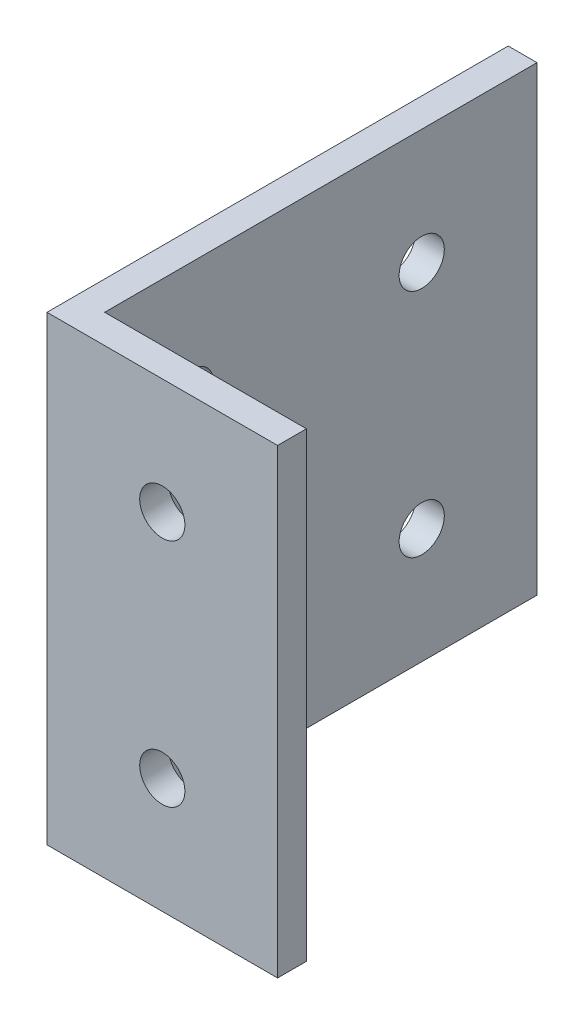
ISO-10303-21;
HEADER;
FILE_DESCRIPTION(('STEP AP214'),'2;1');
FILE_NAME('part.step','',(''),(''),'','','');
FILE_SCHEMA(('AUTOMOTIVE_DESIGN { 1 0 10303 214 1 1 1 1 }'));
ENDSEC;
DATA;
#1=APPLICATION_CONTEXT('core data for automotive mechanical design processes');
#2=APPLICATION_PROTOCOL_DEFINITION('international standard','automotive_design',2000,#1);
#3=PRODUCT_CONTEXT('',#1,'mechanical');
#4=PRODUCT('Part','Part','',(#3));
#5=PRODUCT_RELATED_PRODUCT_CATEGORY('part','',(#4));
#6=PRODUCT_DEFINITION_FORMATION('','',#4);
#7=PRODUCT_DEFINITION_CONTEXT('part definition',#1,'design');
#8=PRODUCT_DEFINITION('design','',#6,#7);
#9=PRODUCT_DEFINITION_SHAPE('','',#8);
#10=(LENGTH_UNIT() NAMED_UNIT(*) SI_UNIT(.MILLI.,.METRE.));
#11=(NAMED_UNIT(*) PLANE_ANGLE_UNIT() SI_UNIT($,.RADIAN.));
#12=(NAMED_UNIT(*) SI_UNIT($,.STERADIAN.) SOLID_ANGLE_UNIT());
#13=UNCERTAINTY_MEASURE_WITH_UNIT(LENGTH_MEASURE(1.E-05),#10,'distance_accuracy_value','');
#14=(GEOMETRIC_REPRESENTATION_CONTEXT(3) GLOBAL_UNCERTAINTY_ASSIGNED_CONTEXT((#13)) GLOBAL_UNIT_ASSIGNED_CONTEXT((#10,
#11,#12)) REPRESENTATION_CONTEXT('',''));
#15=CARTESIAN_POINT('',(0.,0.,0.));
#16=DIRECTION('',(0.,0.,1.));
#17=DIRECTION('',(1.,0.,0.));
#18=AXIS2_PLACEMENT_3D('',#15,#16,#17);
#19=CARTESIAN_POINT('',(25.4,50.8,0.));
#20=DIRECTION('',(0.,0.,-1.));
#21=DIRECTION('',(-1.,0.,0.));
#22=AXIS2_PLACEMENT_3D('',#19,#20,#21);
#23=PLANE('',#22);
#24=CARTESIAN_POINT('',(12.7,38.1,0.));
#25=DIRECTION('',(0.,0.,-1.));
#26=DIRECTION('',(-1.,0.,0.));
#27=AXIS2_PLACEMENT_3D('',#24,#25,#26);
#28=CIRCLE('',#27,2.4892);
#29=CARTESIAN_POINT('',(10.2108,38.1,0.));
#30=VERTEX_POINT('',#29);
#31=EDGE_CURVE('E186',#30,#30,#28,.T.);
#32=ORIENTED_EDGE('',*,*,#31,.T.);
#33=EDGE_LOOP('',(#32));
#34=FACE_BOUND('',#33,.T.);
#35=CARTESIAN_POINT('',(12.7,12.7,0.));
#36=DIRECTION('',(0.,0.,-1.));
#37=DIRECTION('',(-1.,0.,0.));
#38=AXIS2_PLACEMENT_3D('',#35,#36,#37);
#39=CIRCLE('',#38,2.4892);
#40=CARTESIAN_POINT('',(10.2108,12.7,0.));
#41=VERTEX_POINT('',#40);
#42=EDGE_CURVE('E189',#41,#41,#39,.T.);
#43=ORIENTED_EDGE('',*,*,#42,.T.);
#44=EDGE_LOOP('',(#43));
#45=FACE_BOUND('',#44,.T.);
#46=DIRECTION('',(1.,0.,0.));
#47=VECTOR('',#46,1.);
#48=CARTESIAN_POINT('',(25.4,0.,0.));
#49=LINE('',#48,#47);
#50=CARTESIAN_POINT('',(0.,0.,0.));
#51=VERTEX_POINT('',#50);
#52=CARTESIAN_POINT('',(25.4,0.,0.));
#53=VERTEX_POINT('',#52);
#54=EDGE_CURVE('E129',#51,#53,#49,.T.);
#55=ORIENTED_EDGE('',*,*,#54,.T.);
#56=DIRECTION('',(0.,-1.,0.));
#57=VECTOR('',#56,1.);
#58=CARTESIAN_POINT('',(25.4,50.8,0.));
#59=LINE('',#58,#57);
#60=CARTESIAN_POINT('',(25.4,50.8,0.));
#61=VERTEX_POINT('',#60);
#62=EDGE_CURVE('E11',#61,#53,#59,.T.);
#63=ORIENTED_EDGE('',*,*,#62,.F.);
#64=DIRECTION('',(1.,0.,0.));
#65=VECTOR('',#64,1.);
#66=CARTESIAN_POINT('',(25.4,50.8,0.));
#67=LINE('',#66,#65);
#68=CARTESIAN_POINT('',(0.,50.8,0.));
#69=VERTEX_POINT('',#68);
#70=EDGE_CURVE('E146',#69,#61,#67,.T.);
#71=ORIENTED_EDGE('',*,*,#70,.F.);
#72=DIRECTION('',(0.,-1.,0.));
#73=VECTOR('',#72,1.);
#74=CARTESIAN_POINT('',(0.,50.8,0.));
#75=LINE('',#74,#73);
#76=EDGE_CURVE('E125',#69,#51,#75,.T.);
#77=ORIENTED_EDGE('',*,*,#76,.T.);
#78=EDGE_LOOP('',(#55,#63,#71,#77));
#79=FACE_BOUND('',#78,.T.);
#80=ADVANCED_FACE('F39',(#34,#45,#79),#23,.F.);
#81=CARTESIAN_POINT('',(25.4,50.8,-3.175));
#82=DIRECTION('',(-1.,0.,0.));
#83=DIRECTION('',(0.,0.,1.));
#84=AXIS2_PLACEMENT_3D('',#81,#82,#83);
#85=PLANE('',#84);
#86=DIRECTION('',(0.,0.,-1.));
#87=VECTOR('',#86,1.);
#88=CARTESIAN_POINT('',(25.4,0.,-3.175));
#89=LINE('',#88,#87);
#90=CARTESIAN_POINT('',(25.4,0.,-3.175));
#91=VERTEX_POINT('',#90);
#92=EDGE_CURVE('E133',#53,#91,#89,.T.);
#93=ORIENTED_EDGE('',*,*,#92,.T.);
#94=DIRECTION('',(0.,-1.,0.));
#95=VECTOR('',#94,1.);
#96=CARTESIAN_POINT('',(25.4,50.8,-3.175));
#97=LINE('',#96,#95);
#98=CARTESIAN_POINT('',(25.4,50.8,-3.175));
#99=VERTEX_POINT('',#98);
#100=EDGE_CURVE('E48',#99,#91,#97,.T.);
#101=ORIENTED_EDGE('',*,*,#100,.F.);
#102=DIRECTION('',(0.,0.,-1.));
#103=VECTOR('',#102,1.);
#104=CARTESIAN_POINT('',(25.4,50.8,-3.175));
#105=LINE('',#104,#103);
#106=EDGE_CURVE('E93',#61,#99,#105,.T.);
#107=ORIENTED_EDGE('',*,*,#106,.F.);
#108=ORIENTED_EDGE('',*,*,#62,.T.);
#109=EDGE_LOOP('',(#93,#101,#107,#108));
#110=FACE_BOUND('',#109,.T.);
#111=ADVANCED_FACE('F178',(#110),#85,.F.);
#112=CARTESIAN_POINT('',(3.175,50.8,-3.175));
#113=DIRECTION('',(0.,0.,1.));
#114=DIRECTION('',(1.,0.,0.));
#115=AXIS2_PLACEMENT_3D('',#112,#113,#114);
#116=PLANE('',#115);
#117=CARTESIAN_POINT('',(12.7,38.1,-3.175));
#118=DIRECTION('',(0.,0.,-1.));
#119=DIRECTION('',(-1.,0.,0.));
#120=AXIS2_PLACEMENT_3D('',#117,#118,#119);
#121=CIRCLE('',#120,2.4892);
#122=CARTESIAN_POINT('',(10.2108,38.1,-3.175));
#123=VERTEX_POINT('',#122);
#124=EDGE_CURVE('E197',#123,#123,#121,.T.);
#125=ORIENTED_EDGE('',*,*,#124,.F.);
#126=EDGE_LOOP('',(#125));
#127=FACE_BOUND('',#126,.T.);
#128=CARTESIAN_POINT('',(12.7,12.7,-3.175));
#129=DIRECTION('',(0.,0.,-1.));
#130=DIRECTION('',(-1.,0.,0.));
#131=AXIS2_PLACEMENT_3D('',#128,#129,#130);
#132=CIRCLE('',#131,2.4892);
#133=CARTESIAN_POINT('',(10.2108,12.7,-3.175));
#134=VERTEX_POINT('',#133);
#135=EDGE_CURVE('E192',#134,#134,#132,.T.);
#136=ORIENTED_EDGE('',*,*,#135,.F.);
#137=EDGE_LOOP('',(#136));
#138=FACE_BOUND('',#137,.T.);
#139=DIRECTION('',(-1.,0.,0.));
#140=VECTOR('',#139,1.);
#141=CARTESIAN_POINT('',(3.175,0.,-3.175));
#142=LINE('',#141,#140);
#143=CARTESIAN_POINT('',(3.175,0.,-3.175));
#144=VERTEX_POINT('',#143);
#145=EDGE_CURVE('E137',#91,#144,#142,.T.);
#146=ORIENTED_EDGE('',*,*,#145,.T.);
#147=DIRECTION('',(0.,-1.,0.));
#148=VECTOR('',#147,1.);
#149=CARTESIAN_POINT('',(3.175,50.8,-3.175));
#150=LINE('',#149,#148);
#151=CARTESIAN_POINT('',(3.175,50.8,-3.175));
#152=VERTEX_POINT('',#151);
#153=EDGE_CURVE('E117',#152,#144,#150,.T.);
#154=ORIENTED_EDGE('',*,*,#153,.F.);
#155=DIRECTION('',(-1.,0.,0.));
#156=VECTOR('',#155,1.);
#157=CARTESIAN_POINT('',(3.175,50.8,-3.175));
#158=LINE('',#157,#156);
#159=EDGE_CURVE('E106',#99,#152,#158,.T.);
#160=ORIENTED_EDGE('',*,*,#159,.F.);
#161=ORIENTED_EDGE('',*,*,#100,.T.);
#162=EDGE_LOOP('',(#146,#154,#160,#161));
#163=FACE_BOUND('',#162,.T.);
#164=ADVANCED_FACE('F157',(#127,#138,#163),#116,.F.);
#165=CARTESIAN_POINT('',(3.175,50.8,-50.8));
#166=DIRECTION('',(-1.,0.,0.));
#167=DIRECTION('',(0.,0.,1.));
#168=AXIS2_PLACEMENT_3D('',#165,#166,#167);
#169=PLANE('',#168);
#170=CARTESIAN_POINT('',(3.175,38.1,-12.7));
#171=DIRECTION('',(1.,0.,0.));
#172=DIRECTION('',(0.,0.,-1.));
#173=AXIS2_PLACEMENT_3D('',#170,#171,#172);
#174=CIRCLE('',#173,2.4892);
#175=CARTESIAN_POINT('',(3.175,38.1,-15.1892));
#176=VERTEX_POINT('',#175);
#177=EDGE_CURVE('E218',#176,#176,#174,.T.);
#178=ORIENTED_EDGE('',*,*,#177,.F.);
#179=EDGE_LOOP('',(#178));
#180=FACE_BOUND('',#179,.T.);
#181=CARTESIAN_POINT('',(3.175,12.7,-12.7));
#182=DIRECTION('',(1.,0.,0.));
#183=DIRECTION('',(0.,0.,-1.));
#184=AXIS2_PLACEMENT_3D('',#181,#182,#183);
#185=CIRCLE('',#184,2.4892);
#186=CARTESIAN_POINT('',(3.175,12.7,-15.1892));
#187=VERTEX_POINT('',#186);
#188=EDGE_CURVE('E210',#187,#187,#185,.T.);
#189=ORIENTED_EDGE('',*,*,#188,.F.);
#190=EDGE_LOOP('',(#189));
#191=FACE_BOUND('',#190,.T.);
#192=CARTESIAN_POINT('',(3.175,12.7,-38.1));
#193=DIRECTION('',(1.,0.,0.));
#194=DIRECTION('',(0.,0.,-1.));
#195=AXIS2_PLACEMENT_3D('',#192,#193,#194);
#196=CIRCLE('',#195,2.4892);
#197=CARTESIAN_POINT('',(3.175,12.7,-40.5892));
#198=VERTEX_POINT('',#197);
#199=EDGE_CURVE('E201',#198,#198,#196,.T.);
#200=ORIENTED_EDGE('',*,*,#199,.F.);
#201=EDGE_LOOP('',(#200));
#202=FACE_BOUND('',#201,.T.);
#203=CARTESIAN_POINT('',(3.175,38.1,-38.1));
#204=DIRECTION('',(1.,0.,0.));
#205=DIRECTION('',(0.,0.,-1.));
#206=AXIS2_PLACEMENT_3D('',#203,#204,#205);
#207=CIRCLE('',#206,2.4892);
#208=CARTESIAN_POINT('',(3.175,38.1,-40.5892));
#209=VERTEX_POINT('',#208);
#210=EDGE_CURVE('E205',#209,#209,#207,.T.);
#211=ORIENTED_EDGE('',*,*,#210,.F.);
#212=EDGE_LOOP('',(#211));
#213=FACE_BOUND('',#212,.T.);
#214=DIRECTION('',(0.,0.,-1.));
#215=VECTOR('',#214,1.);
#216=CARTESIAN_POINT('',(3.175,0.,-50.8));
#217=LINE('',#216,#215);
#218=CARTESIAN_POINT('',(3.175,0.,-50.8));
#219=VERTEX_POINT('',#218);
#220=EDGE_CURVE('E115',#144,#219,#217,.T.);
#221=ORIENTED_EDGE('',*,*,#220,.T.);
#222=DIRECTION('',(0.,-1.,0.));
#223=VECTOR('',#222,1.);
#224=CARTESIAN_POINT('',(3.175,50.8,-50.8));
#225=LINE('',#224,#223);
#226=CARTESIAN_POINT('',(3.175,50.8,-50.8));
#227=VERTEX_POINT('',#226);
#228=EDGE_CURVE('E112',#227,#219,#225,.T.);
#229=ORIENTED_EDGE('',*,*,#228,.F.);
#230=DIRECTION('',(0.,0.,-1.));
#231=VECTOR('',#230,1.);
#232=CARTESIAN_POINT('',(3.175,50.8,-50.8));
#233=LINE('',#232,#231);
#234=EDGE_CURVE('E100',#152,#227,#233,.T.);
#235=ORIENTED_EDGE('',*,*,#234,.F.);
#236=ORIENTED_EDGE('',*,*,#153,.T.);
#237=EDGE_LOOP('',(#221,#229,#235,#236));
#238=FACE_BOUND('',#237,.T.);
#239=ADVANCED_FACE('F113',(#180,#191,#202,#213,#238),#169,.F.);
#240=CARTESIAN_POINT('',(0.,50.8,-50.8));
#241=DIRECTION('',(0.,0.,1.));
#242=DIRECTION('',(1.,0.,0.));
#243=AXIS2_PLACEMENT_3D('',#240,#241,#242);
#244=PLANE('',#243);
#245=DIRECTION('',(-1.,0.,0.));
#246=VECTOR('',#245,1.);
#247=CARTESIAN_POINT('',(0.,0.,-50.8));
#248=LINE('',#247,#246);
#249=CARTESIAN_POINT('',(0.,0.,-50.8));
#250=VERTEX_POINT('',#249);
#251=EDGE_CURVE('E79',#219,#250,#248,.T.);
#252=ORIENTED_EDGE('',*,*,#251,.T.);
#253=DIRECTION('',(0.,-1.,0.));
#254=VECTOR('',#253,1.);
#255=CARTESIAN_POINT('',(0.,50.8,-50.8));
#256=LINE('',#255,#254);
#257=CARTESIAN_POINT('',(0.,50.8,-50.8));
#258=VERTEX_POINT('',#257);
#259=EDGE_CURVE('E118',#258,#250,#256,.T.);
#260=ORIENTED_EDGE('',*,*,#259,.F.);
#261=DIRECTION('',(-1.,0.,0.));
#262=VECTOR('',#261,1.);
#263=CARTESIAN_POINT('',(0.,50.8,-50.8));
#264=LINE('',#263,#262);
#265=EDGE_CURVE('E104',#227,#258,#264,.T.);
#266=ORIENTED_EDGE('',*,*,#265,.F.);
#267=ORIENTED_EDGE('',*,*,#228,.T.);
#268=EDGE_LOOP('',(#252,#260,#266,#267));
#269=FACE_BOUND('',#268,.T.);
#270=ADVANCED_FACE('F120',(#269),#244,.F.);
#271=CARTESIAN_POINT('',(0.,50.8,0.));
#272=DIRECTION('',(1.,0.,0.));
#273=DIRECTION('',(0.,0.,-1.));
#274=AXIS2_PLACEMENT_3D('',#271,#272,#273);
#275=PLANE('',#274);
#276=CARTESIAN_POINT('',(0.,38.1,-12.7));
#277=DIRECTION('',(1.,0.,0.));
#278=DIRECTION('',(0.,0.,-1.));
#279=AXIS2_PLACEMENT_3D('',#276,#277,#278);
#280=CIRCLE('',#279,2.4892);
#281=CARTESIAN_POINT('',(0.,38.1,-15.1892));
#282=VERTEX_POINT('',#281);
#283=EDGE_CURVE('E222',#282,#282,#280,.T.);
#284=ORIENTED_EDGE('',*,*,#283,.T.);
#285=EDGE_LOOP('',(#284));
#286=FACE_BOUND('',#285,.T.);
#287=CARTESIAN_POINT('',(0.,12.7,-12.7));
#288=DIRECTION('',(1.,0.,0.));
#289=DIRECTION('',(0.,0.,-1.));
#290=AXIS2_PLACEMENT_3D('',#287,#288,#289);
#291=CIRCLE('',#290,2.4892);
#292=CARTESIAN_POINT('',(0.,12.7,-15.1892));
#293=VERTEX_POINT('',#292);
#294=EDGE_CURVE('E214',#293,#293,#291,.T.);
#295=ORIENTED_EDGE('',*,*,#294,.T.);
#296=EDGE_LOOP('',(#295));
#297=FACE_BOUND('',#296,.T.);
#298=CARTESIAN_POINT('',(0.,12.7,-38.1));
#299=DIRECTION('',(1.,0.,0.));
#300=DIRECTION('',(0.,0.,-1.));
#301=AXIS2_PLACEMENT_3D('',#298,#299,#300);
#302=CIRCLE('',#301,2.4892);
#303=CARTESIAN_POINT('',(0.,12.7,-40.5892));
#304=VERTEX_POINT('',#303);
#305=EDGE_CURVE('E206',#304,#304,#302,.T.);
#306=ORIENTED_EDGE('',*,*,#305,.T.);
#307=EDGE_LOOP('',(#306));
#308=FACE_BOUND('',#307,.T.);
#309=CARTESIAN_POINT('',(0.,38.1,-38.1));
#310=DIRECTION('',(1.,0.,0.));
#311=DIRECTION('',(0.,0.,-1.));
#312=AXIS2_PLACEMENT_3D('',#309,#310,#311);
#313=CIRCLE('',#312,2.4892);
#314=CARTESIAN_POINT('',(0.,38.1,-40.5892));
#315=VERTEX_POINT('',#314);
#316=EDGE_CURVE('E134',#315,#315,#313,.T.);
#317=ORIENTED_EDGE('',*,*,#316,.T.);
#318=EDGE_LOOP('',(#317));
#319=FACE_BOUND('',#318,.T.);
#320=DIRECTION('',(0.,0.,1.));
#321=VECTOR('',#320,1.);
#322=CARTESIAN_POINT('',(0.,0.,0.));
#323=LINE('',#322,#321);
#324=EDGE_CURVE('E85',#250,#51,#323,.T.);
#325=ORIENTED_EDGE('',*,*,#324,.T.);
#326=ORIENTED_EDGE('',*,*,#76,.F.);
#327=DIRECTION('',(0.,0.,1.));
#328=VECTOR('',#327,1.);
#329=CARTESIAN_POINT('',(0.,50.8,0.));
#330=LINE('',#329,#328);
#331=EDGE_CURVE('E56',#258,#69,#330,.T.);
#332=ORIENTED_EDGE('',*,*,#331,.F.);
#333=ORIENTED_EDGE('',*,*,#259,.T.);
#334=EDGE_LOOP('',(#325,#326,#332,#333));
#335=FACE_BOUND('',#334,.T.);
#336=ADVANCED_FACE('F164',(#286,#297,#308,#319,#335),#275,.F.);
#337=CARTESIAN_POINT('',(0.,50.8,0.));
#338=DIRECTION('',(0.,-1.,0.));
#339=DIRECTION('',(0.,0.,-1.));
#340=AXIS2_PLACEMENT_3D('',#337,#338,#339);
#341=PLANE('',#340);
#342=ORIENTED_EDGE('',*,*,#70,.T.);
#343=ORIENTED_EDGE('',*,*,#106,.T.);
#344=ORIENTED_EDGE('',*,*,#159,.T.);
#345=ORIENTED_EDGE('',*,*,#234,.T.);
#346=ORIENTED_EDGE('',*,*,#265,.T.);
#347=ORIENTED_EDGE('',*,*,#331,.T.);
#348=EDGE_LOOP('',(#342,#343,#344,#345,#346,#347));
#349=FACE_BOUND('',#348,.T.);
#350=ADVANCED_FACE('F102',(#349),#341,.F.);
#351=CARTESIAN_POINT('',(0.,0.,0.));
#352=DIRECTION('',(0.,-1.,0.));
#353=DIRECTION('',(0.,0.,-1.));
#354=AXIS2_PLACEMENT_3D('',#351,#352,#353);
#355=PLANE('',#354);
#356=ORIENTED_EDGE('',*,*,#54,.F.);
#357=ORIENTED_EDGE('',*,*,#324,.F.);
#358=ORIENTED_EDGE('',*,*,#251,.F.);
#359=ORIENTED_EDGE('',*,*,#220,.F.);
#360=ORIENTED_EDGE('',*,*,#145,.F.);
#361=ORIENTED_EDGE('',*,*,#92,.F.);
#362=EDGE_LOOP('',(#356,#357,#358,#359,#360,#361));
#363=FACE_BOUND('',#362,.T.);
#364=ADVANCED_FACE('F160',(#363),#355,.T.);
#365=CARTESIAN_POINT('',(0.,38.1,-38.1));
#366=DIRECTION('',(1.,0.,0.));
#367=DIRECTION('',(0.,0.,-1.));
#368=AXIS2_PLACEMENT_3D('',#365,#366,#367);
#369=CYLINDRICAL_SURFACE('',#368,2.4892);
#370=CARTESIAN_POINT('',(0.,38.1,-40.5892));
#371=CARTESIAN_POINT('',(0.0330729166666635,38.1,-40.5892));
#372=CARTESIAN_POINT('',(0.0661458333333302,38.1,-40.5892));
#373=CARTESIAN_POINT('',(0.132291666666664,38.1,-40.5892));
#374=CARTESIAN_POINT('',(0.16536458333333,38.1,-40.5892));
#375=CARTESIAN_POINT('',(0.231510416666664,38.1,-40.5892));
#376=CARTESIAN_POINT('',(0.26458333333333,38.1,-40.5892));
#377=CARTESIAN_POINT('',(0.330729166666664,38.1,-40.5892));
#378=CARTESIAN_POINT('',(0.363802083333331,38.1,-40.5892));
#379=CARTESIAN_POINT('',(0.429947916666664,38.1,-40.5892));
#380=CARTESIAN_POINT('',(0.463020833333331,38.1,-40.5892));
#381=CARTESIAN_POINT('',(0.529166666666664,38.1,-40.5892));
#382=CARTESIAN_POINT('',(0.562239583333331,38.1,-40.5892));
#383=CARTESIAN_POINT('',(0.628385416666664,38.1,-40.5892));
#384=CARTESIAN_POINT('',(0.661458333333331,38.1,-40.5892));
#385=CARTESIAN_POINT('',(0.727604166666664,38.1,-40.5892));
#386=CARTESIAN_POINT('',(0.760677083333331,38.1,-40.5892));
#387=CARTESIAN_POINT('',(0.826822916666664,38.1,-40.5892));
#388=CARTESIAN_POINT('',(0.859895833333331,38.1,-40.5892));
#389=CARTESIAN_POINT('',(0.926041666666665,38.1,-40.5892));
#390=CARTESIAN_POINT('',(0.959114583333331,38.1,-40.5892));
#391=CARTESIAN_POINT('',(1.02526041666666,38.1,-40.5892));
#392=CARTESIAN_POINT('',(1.05833333333333,38.1,-40.5892));
#393=CARTESIAN_POINT('',(1.12447916666666,38.1,-40.5892));
#394=CARTESIAN_POINT('',(1.15755208333333,38.1,-40.5892));
#395=CARTESIAN_POINT('',(1.22369791666666,38.1,-40.5892));
#396=CARTESIAN_POINT('',(1.25677083333333,38.1,-40.5892));
#397=CARTESIAN_POINT('',(1.32291666666666,38.1,-40.5892));
#398=CARTESIAN_POINT('',(1.35598958333333,38.1,-40.5892));
#399=CARTESIAN_POINT('',(1.42213541666667,38.1,-40.5892));
#400=CARTESIAN_POINT('',(1.45520833333333,38.1,-40.5892));
#401=CARTESIAN_POINT('',(1.52135416666667,38.1,-40.5892));
#402=CARTESIAN_POINT('',(1.55442708333333,38.1,-40.5892));
#403=CARTESIAN_POINT('',(1.62057291666667,38.1,-40.5892));
#404=CARTESIAN_POINT('',(1.65364583333333,38.1,-40.5892));
#405=CARTESIAN_POINT('',(1.71979166666667,38.1,-40.5892));
#406=CARTESIAN_POINT('',(1.75286458333333,38.1,-40.5892));
#407=CARTESIAN_POINT('',(1.81901041666667,38.1,-40.5892));
#408=CARTESIAN_POINT('',(1.85208333333333,38.1,-40.5892));
#409=CARTESIAN_POINT('',(1.91822916666667,38.1,-40.5892));
#410=CARTESIAN_POINT('',(1.95130208333333,38.1,-40.5892));
#411=CARTESIAN_POINT('',(2.01744791666667,38.1,-40.5892));
#412=CARTESIAN_POINT('',(2.05052083333333,38.1,-40.5892));
#413=CARTESIAN_POINT('',(2.11666666666667,38.1,-40.5892));
#414=CARTESIAN_POINT('',(2.14973958333333,38.1,-40.5892));
#415=CARTESIAN_POINT('',(2.21588541666667,38.1,-40.5892));
#416=CARTESIAN_POINT('',(2.24895833333333,38.1,-40.5892));
#417=CARTESIAN_POINT('',(2.31510416666667,38.1,-40.5892));
#418=CARTESIAN_POINT('',(2.34817708333333,38.1,-40.5892));
#419=CARTESIAN_POINT('',(2.41432291666667,38.1,-40.5892));
#420=CARTESIAN_POINT('',(2.44739583333333,38.1,-40.5892));
#421=CARTESIAN_POINT('',(2.51354166666667,38.1,-40.5892));
#422=CARTESIAN_POINT('',(2.54661458333333,38.1,-40.5892));
#423=CARTESIAN_POINT('',(2.61276041666667,38.1,-40.5892));
#424=CARTESIAN_POINT('',(2.64583333333333,38.1,-40.5892));
#425=CARTESIAN_POINT('',(2.71197916666667,38.1,-40.5892));
#426=CARTESIAN_POINT('',(2.74505208333333,38.1,-40.5892));
#427=CARTESIAN_POINT('',(2.81119791666667,38.1,-40.5892));
#428=CARTESIAN_POINT('',(2.84427083333333,38.1,-40.5892));
#429=CARTESIAN_POINT('',(2.91041666666667,38.1,-40.5892));
#430=CARTESIAN_POINT('',(2.94348958333333,38.1,-40.5892));
#431=CARTESIAN_POINT('',(3.00963541666667,38.1,-40.5892));
#432=CARTESIAN_POINT('',(3.04270833333333,38.1,-40.5892));
#433=CARTESIAN_POINT('',(3.10885416666667,38.1,-40.5892));
#434=CARTESIAN_POINT('',(3.14192708333333,38.1,-40.5892));
#435=CARTESIAN_POINT('',(3.175,38.1,-40.5892));
#436=B_SPLINE_CURVE_WITH_KNOTS('',3,(#370,#371,#372,#373,#374,#375,#376,#377,#378,#379,#380,
#381,#382,#383,#384,#385,#386,#387,#388,#389,#390,#391,#392,#393,#394,#395,#396,#397,#398,#399,
#400,#401,#402,#403,#404,#405,#406,#407,#408,#409,#410,#411,#412,#413,#414,#415,#416,#417,#418,
#419,#420,#421,#422,#423,#424,#425,#426,#427,#428,#429,#430,#431,#432,#433,#434,#435),
.UNSPECIFIED.,.F.,.F.,(4,2,2,2,2,2,2,2,2,2,2,2,2,2,2,2,2,2,2,2,2,2,2,2,2,2,2,2,2,2,2,2,4),(0.,
0.0992187500000001,0.1984375,0.29765625,0.396875,0.49609375,0.595312500000001,0.694531250000001,
0.793750000000001,0.892968750000001,0.992187500000001,1.09140625,1.190625,1.28984375,1.3890625,
1.48828125,1.5875,1.68671875,1.7859375,1.88515625,1.984375,2.08359375,2.1828125,2.28203125,
2.38125,2.48046875,2.5796875,2.67890625,2.778125,2.87734375,2.9765625,3.07578125,3.175),.UNSPECIFIED.);
#437=EDGE_CURVE('BSEAM286',#315,#209,#436,.T.);
#438=ORIENTED_EDGE('',*,*,#316,.F.);
#439=ORIENTED_EDGE('',*,*,#210,.T.);
#440=ORIENTED_EDGE('',*,*,#437,.T.);
#441=ORIENTED_EDGE('',*,*,#437,.F.);
#442=EDGE_LOOP('',(#438,#440,#439,#441));
#443=FACE_BOUND('',#442,.T.);
#444=ADVANCED_FACE('F286',(#443),#369,.F.);
#445=CARTESIAN_POINT('',(0.,12.7,-38.1));
#446=DIRECTION('',(1.,0.,0.));
#447=DIRECTION('',(0.,0.,-1.));
#448=AXIS2_PLACEMENT_3D('',#445,#446,#447);
#449=CYLINDRICAL_SURFACE('',#448,2.4892);
#450=CARTESIAN_POINT('',(0.,12.7,-40.5892));
#451=CARTESIAN_POINT('',(0.0330729166666635,12.7,-40.5892));
#452=CARTESIAN_POINT('',(0.0661458333333302,12.7,-40.5892));
#453=CARTESIAN_POINT('',(0.132291666666664,12.7,-40.5892));
#454=CARTESIAN_POINT('',(0.16536458333333,12.7,-40.5892));
#455=CARTESIAN_POINT('',(0.231510416666664,12.7,-40.5892));
#456=CARTESIAN_POINT('',(0.26458333333333,12.7,-40.5892));
#457=CARTESIAN_POINT('',(0.330729166666664,12.7,-40.5892));
#458=CARTESIAN_POINT('',(0.363802083333331,12.7,-40.5892));
#459=CARTESIAN_POINT('',(0.429947916666664,12.7,-40.5892));
#460=CARTESIAN_POINT('',(0.463020833333331,12.7,-40.5892));
#461=CARTESIAN_POINT('',(0.529166666666664,12.7,-40.5892));
#462=CARTESIAN_POINT('',(0.562239583333331,12.7,-40.5892));
#463=CARTESIAN_POINT('',(0.628385416666664,12.7,-40.5892));
#464=CARTESIAN_POINT('',(0.661458333333331,12.7,-40.5892));
#465=CARTESIAN_POINT('',(0.727604166666664,12.7,-40.5892));
#466=CARTESIAN_POINT('',(0.760677083333331,12.7,-40.5892));
#467=CARTESIAN_POINT('',(0.826822916666664,12.7,-40.5892));
#468=CARTESIAN_POINT('',(0.859895833333331,12.7,-40.5892));
#469=CARTESIAN_POINT('',(0.926041666666665,12.7,-40.5892));
#470=CARTESIAN_POINT('',(0.959114583333331,12.7,-40.5892));
#471=CARTESIAN_POINT('',(1.02526041666666,12.7,-40.5892));
#472=CARTESIAN_POINT('',(1.05833333333333,12.7,-40.5892));
#473=CARTESIAN_POINT('',(1.12447916666666,12.7,-40.5892));
#474=CARTESIAN_POINT('',(1.15755208333333,12.7,-40.5892));
#475=CARTESIAN_POINT('',(1.22369791666666,12.7,-40.5892));
#476=CARTESIAN_POINT('',(1.25677083333333,12.7,-40.5892));
#477=CARTESIAN_POINT('',(1.32291666666666,12.7,-40.5892));
#478=CARTESIAN_POINT('',(1.35598958333333,12.7,-40.5892));
#479=CARTESIAN_POINT('',(1.42213541666667,12.7,-40.5892));
#480=CARTESIAN_POINT('',(1.45520833333333,12.7,-40.5892));
#481=CARTESIAN_POINT('',(1.52135416666667,12.7,-40.5892));
#482=CARTESIAN_POINT('',(1.55442708333333,12.7,-40.5892));
#483=CARTESIAN_POINT('',(1.62057291666667,12.7,-40.5892));
#484=CARTESIAN_POINT('',(1.65364583333333,12.7,-40.5892));
#485=CARTESIAN_POINT('',(1.71979166666667,12.7,-40.5892));
#486=CARTESIAN_POINT('',(1.75286458333333,12.7,-40.5892));
#487=CARTESIAN_POINT('',(1.81901041666667,12.7,-40.5892));
#488=CARTESIAN_POINT('',(1.85208333333333,12.7,-40.5892));
#489=CARTESIAN_POINT('',(1.91822916666667,12.7,-40.5892));
#490=CARTESIAN_POINT('',(1.95130208333333,12.7,-40.5892));
#491=CARTESIAN_POINT('',(2.01744791666667,12.7,-40.5892));
#492=CARTESIAN_POINT('',(2.05052083333333,12.7,-40.5892));
#493=CARTESIAN_POINT('',(2.11666666666667,12.7,-40.5892));
#494=CARTESIAN_POINT('',(2.14973958333333,12.7,-40.5892));
#495=CARTESIAN_POINT('',(2.21588541666667,12.7,-40.5892));
#496=CARTESIAN_POINT('',(2.24895833333333,12.7,-40.5892));
#497=CARTESIAN_POINT('',(2.31510416666667,12.7,-40.5892));
#498=CARTESIAN_POINT('',(2.34817708333333,12.7,-40.5892));
#499=CARTESIAN_POINT('',(2.41432291666667,12.7,-40.5892));
#500=CARTESIAN_POINT('',(2.44739583333333,12.7,-40.5892));
#501=CARTESIAN_POINT('',(2.51354166666667,12.7,-40.5892));
#502=CARTESIAN_POINT('',(2.54661458333333,12.7,-40.5892));
#503=CARTESIAN_POINT('',(2.61276041666667,12.7,-40.5892));
#504=CARTESIAN_POINT('',(2.64583333333333,12.7,-40.5892));
#505=CARTESIAN_POINT('',(2.71197916666667,12.7,-40.5892));
#506=CARTESIAN_POINT('',(2.74505208333333,12.7,-40.5892));
#507=CARTESIAN_POINT('',(2.81119791666667,12.7,-40.5892));
#508=CARTESIAN_POINT('',(2.84427083333333,12.7,-40.5892));
#509=CARTESIAN_POINT('',(2.91041666666667,12.7,-40.5892));
#510=CARTESIAN_POINT('',(2.94348958333333,12.7,-40.5892));
#511=CARTESIAN_POINT('',(3.00963541666667,12.7,-40.5892));
#512=CARTESIAN_POINT('',(3.04270833333333,12.7,-40.5892));
#513=CARTESIAN_POINT('',(3.10885416666667,12.7,-40.5892));
#514=CARTESIAN_POINT('',(3.14192708333333,12.7,-40.5892));
#515=CARTESIAN_POINT('',(3.175,12.7,-40.5892));
#516=B_SPLINE_CURVE_WITH_KNOTS('',3,(#450,#451,#452,#453,#454,#455,#456,#457,#458,#459,#460,
#461,#462,#463,#464,#465,#466,#467,#468,#469,#470,#471,#472,#473,#474,#475,#476,#477,#478,#479,
#480,#481,#482,#483,#484,#485,#486,#487,#488,#489,#490,#491,#492,#493,#494,#495,#496,#497,#498,
#499,#500,#501,#502,#503,#504,#505,#506,#507,#508,#509,#510,#511,#512,#513,#514,#515),
.UNSPECIFIED.,.F.,.F.,(4,2,2,2,2,2,2,2,2,2,2,2,2,2,2,2,2,2,2,2,2,2,2,2,2,2,2,2,2,2,2,2,4),(0.,
0.0992187500000001,0.1984375,0.29765625,0.396875,0.49609375,0.595312500000001,0.694531250000001,
0.793750000000001,0.892968750000001,0.992187500000001,1.09140625,1.190625,1.28984375,1.3890625,
1.48828125,1.5875,1.68671875,1.7859375,1.88515625,1.984375,2.08359375,2.1828125,2.28203125,
2.38125,2.48046875,2.5796875,2.67890625,2.778125,2.87734375,2.9765625,3.07578125,3.175),.UNSPECIFIED.);
#517=EDGE_CURVE('BSEAM283',#304,#198,#516,.T.);
#518=ORIENTED_EDGE('',*,*,#305,.F.);
#519=ORIENTED_EDGE('',*,*,#199,.T.);
#520=ORIENTED_EDGE('',*,*,#517,.T.);
#521=ORIENTED_EDGE('',*,*,#517,.F.);
#522=EDGE_LOOP('',(#518,#520,#519,#521));
#523=FACE_BOUND('',#522,.T.);
#524=ADVANCED_FACE('F283',(#523),#449,.F.);
#525=CARTESIAN_POINT('',(0.,12.7,-12.7));
#526=DIRECTION('',(1.,0.,0.));
#527=DIRECTION('',(0.,0.,-1.));
#528=AXIS2_PLACEMENT_3D('',#525,#526,#527);
#529=CYLINDRICAL_SURFACE('',#528,2.4892);
#530=CARTESIAN_POINT('',(0.,12.7,-15.1892));
#531=CARTESIAN_POINT('',(0.0330729166666653,12.7,-15.1892));
#532=CARTESIAN_POINT('',(0.066145833333332,12.7,-15.1892));
#533=CARTESIAN_POINT('',(0.132291666666665,12.7,-15.1892));
#534=CARTESIAN_POINT('',(0.165364583333332,12.7,-15.1892));
#535=CARTESIAN_POINT('',(0.231510416666665,12.7,-15.1892));
#536=CARTESIAN_POINT('',(0.264583333333332,12.7,-15.1892));
#537=CARTESIAN_POINT('',(0.330729166666666,12.7,-15.1892));
#538=CARTESIAN_POINT('',(0.363802083333332,12.7,-15.1892));
#539=CARTESIAN_POINT('',(0.429947916666666,12.7,-15.1892));
#540=CARTESIAN_POINT('',(0.463020833333332,12.7,-15.1892));
#541=CARTESIAN_POINT('',(0.529166666666666,12.7,-15.1892));
#542=CARTESIAN_POINT('',(0.562239583333332,12.7,-15.1892));
#543=CARTESIAN_POINT('',(0.628385416666666,12.7,-15.1892));
#544=CARTESIAN_POINT('',(0.661458333333333,12.7,-15.1892));
#545=CARTESIAN_POINT('',(0.727604166666666,12.7,-15.1892));
#546=CARTESIAN_POINT('',(0.760677083333333,12.7,-15.1892));
#547=CARTESIAN_POINT('',(0.826822916666666,12.7,-15.1892));
#548=CARTESIAN_POINT('',(0.859895833333333,12.7,-15.1892));
#549=CARTESIAN_POINT('',(0.926041666666666,12.7,-15.1892));
#550=CARTESIAN_POINT('',(0.959114583333333,12.7,-15.1892));
#551=CARTESIAN_POINT('',(1.02526041666667,12.7,-15.1892));
#552=CARTESIAN_POINT('',(1.05833333333333,12.7,-15.1892));
#553=CARTESIAN_POINT('',(1.12447916666667,12.7,-15.1892));
#554=CARTESIAN_POINT('',(1.15755208333333,12.7,-15.1892));
#555=CARTESIAN_POINT('',(1.22369791666667,12.7,-15.1892));
#556=CARTESIAN_POINT('',(1.25677083333333,12.7,-15.1892));
#557=CARTESIAN_POINT('',(1.32291666666667,12.7,-15.1892));
#558=CARTESIAN_POINT('',(1.35598958333333,12.7,-15.1892));
#559=CARTESIAN_POINT('',(1.42213541666667,12.7,-15.1892));
#560=CARTESIAN_POINT('',(1.45520833333333,12.7,-15.1892));
#561=CARTESIAN_POINT('',(1.52135416666667,12.7,-15.1892));
#562=CARTESIAN_POINT('',(1.55442708333333,12.7,-15.1892));
#563=CARTESIAN_POINT('',(1.62057291666667,12.7,-15.1892));
#564=CARTESIAN_POINT('',(1.65364583333333,12.7,-15.1892));
#565=CARTESIAN_POINT('',(1.71979166666667,12.7,-15.1892));
#566=CARTESIAN_POINT('',(1.75286458333333,12.7,-15.1892));
#567=CARTESIAN_POINT('',(1.81901041666667,12.7,-15.1892));
#568=CARTESIAN_POINT('',(1.85208333333333,12.7,-15.1892));
#569=CARTESIAN_POINT('',(1.91822916666667,12.7,-15.1892));
#570=CARTESIAN_POINT('',(1.95130208333333,12.7,-15.1892));
#571=CARTESIAN_POINT('',(2.01744791666667,12.7,-15.1892));
#572=CARTESIAN_POINT('',(2.05052083333333,12.7,-15.1892));
#573=CARTESIAN_POINT('',(2.11666666666667,12.7,-15.1892));
#574=CARTESIAN_POINT('',(2.14973958333333,12.7,-15.1892));
#575=CARTESIAN_POINT('',(2.21588541666667,12.7,-15.1892));
#576=CARTESIAN_POINT('',(2.24895833333333,12.7,-15.1892));
#577=CARTESIAN_POINT('',(2.31510416666667,12.7,-15.1892));
#578=CARTESIAN_POINT('',(2.34817708333333,12.7,-15.1892));
#579=CARTESIAN_POINT('',(2.41432291666667,12.7,-15.1892));
#580=CARTESIAN_POINT('',(2.44739583333333,12.7,-15.1892));
#581=CARTESIAN_POINT('',(2.51354166666667,12.7,-15.1892));
#582=CARTESIAN_POINT('',(2.54661458333334,12.7,-15.1892));
#583=CARTESIAN_POINT('',(2.61276041666667,12.7,-15.1892));
#584=CARTESIAN_POINT('',(2.64583333333334,12.7,-15.1892));
#585=CARTESIAN_POINT('',(2.71197916666667,12.7,-15.1892));
#586=CARTESIAN_POINT('',(2.74505208333334,12.7,-15.1892));
#587=CARTESIAN_POINT('',(2.81119791666667,12.7,-15.1892));
#588=CARTESIAN_POINT('',(2.84427083333334,12.7,-15.1892));
#589=CARTESIAN_POINT('',(2.91041666666667,12.7,-15.1892));
#590=CARTESIAN_POINT('',(2.94348958333334,12.7,-15.1892));
#591=CARTESIAN_POINT('',(3.00963541666667,12.7,-15.1892));
#592=CARTESIAN_POINT('',(3.04270833333334,12.7,-15.1892));
#593=CARTESIAN_POINT('',(3.10885416666667,12.7,-15.1892));
#594=CARTESIAN_POINT('',(3.14192708333334,12.7,-15.1892));
#595=CARTESIAN_POINT('',(3.175,12.7,-15.1892));
#596=B_SPLINE_CURVE_WITH_KNOTS('',3,(#530,#531,#532,#533,#534,#535,#536,#537,#538,#539,#540,
#541,#542,#543,#544,#545,#546,#547,#548,#549,#550,#551,#552,#553,#554,#555,#556,#557,#558,#559,
#560,#561,#562,#563,#564,#565,#566,#567,#568,#569,#570,#571,#572,#573,#574,#575,#576,#577,#578,
#579,#580,#581,#582,#583,#584,#585,#586,#587,#588,#589,#590,#591,#592,#593,#594,#595),
.UNSPECIFIED.,.F.,.F.,(4,2,2,2,2,2,2,2,2,2,2,2,2,2,2,2,2,2,2,2,2,2,2,2,2,2,2,2,2,2,2,2,4),(0.,
0.0992187500000001,0.1984375,0.29765625,0.396875,0.49609375,0.595312500000001,0.694531250000001,
0.793750000000001,0.892968750000001,0.992187500000001,1.09140625,1.190625,1.28984375,1.3890625,
1.48828125,1.5875,1.68671875,1.7859375,1.88515625,1.984375,2.08359375,2.1828125,2.28203125,
2.38125,2.48046875,2.5796875,2.67890625,2.778125,2.87734375,2.9765625,3.07578125,3.175),.UNSPECIFIED.);
#597=EDGE_CURVE('BSEAM279',#293,#187,#596,.T.);
#598=ORIENTED_EDGE('',*,*,#294,.F.);
#599=ORIENTED_EDGE('',*,*,#188,.T.);
#600=ORIENTED_EDGE('',*,*,#597,.T.);
#601=ORIENTED_EDGE('',*,*,#597,.F.);
#602=EDGE_LOOP('',(#598,#600,#599,#601));
#603=FACE_BOUND('',#602,.T.);
#604=ADVANCED_FACE('F279',(#603),#529,.F.);
#605=CARTESIAN_POINT('',(0.,38.1,-12.7));
#606=DIRECTION('',(1.,0.,0.));
#607=DIRECTION('',(0.,0.,-1.));
#608=AXIS2_PLACEMENT_3D('',#605,#606,#607);
#609=CYLINDRICAL_SURFACE('',#608,2.4892);
#610=CARTESIAN_POINT('',(0.,38.1,-15.1892));
#611=CARTESIAN_POINT('',(0.0330729166666653,38.1,-15.1892));
#612=CARTESIAN_POINT('',(0.066145833333332,38.1,-15.1892));
#613=CARTESIAN_POINT('',(0.132291666666665,38.1,-15.1892));
#614=CARTESIAN_POINT('',(0.165364583333332,38.1,-15.1892));
#615=CARTESIAN_POINT('',(0.231510416666665,38.1,-15.1892));
#616=CARTESIAN_POINT('',(0.264583333333332,38.1,-15.1892));
#617=CARTESIAN_POINT('',(0.330729166666666,38.1,-15.1892));
#618=CARTESIAN_POINT('',(0.363802083333332,38.1,-15.1892));
#619=CARTESIAN_POINT('',(0.429947916666666,38.1,-15.1892));
#620=CARTESIAN_POINT('',(0.463020833333332,38.1,-15.1892));
#621=CARTESIAN_POINT('',(0.529166666666666,38.1,-15.1892));
#622=CARTESIAN_POINT('',(0.562239583333332,38.1,-15.1892));
#623=CARTESIAN_POINT('',(0.628385416666666,38.1,-15.1892));
#624=CARTESIAN_POINT('',(0.661458333333333,38.1,-15.1892));
#625=CARTESIAN_POINT('',(0.727604166666666,38.1,-15.1892));
#626=CARTESIAN_POINT('',(0.760677083333333,38.1,-15.1892));
#627=CARTESIAN_POINT('',(0.826822916666666,38.1,-15.1892));
#628=CARTESIAN_POINT('',(0.859895833333333,38.1,-15.1892));
#629=CARTESIAN_POINT('',(0.926041666666666,38.1,-15.1892));
#630=CARTESIAN_POINT('',(0.959114583333333,38.1,-15.1892));
#631=CARTESIAN_POINT('',(1.02526041666667,38.1,-15.1892));
#632=CARTESIAN_POINT('',(1.05833333333333,38.1,-15.1892));
#633=CARTESIAN_POINT('',(1.12447916666667,38.1,-15.1892));
#634=CARTESIAN_POINT('',(1.15755208333333,38.1,-15.1892));
#635=CARTESIAN_POINT('',(1.22369791666667,38.1,-15.1892));
#636=CARTESIAN_POINT('',(1.25677083333333,38.1,-15.1892));
#637=CARTESIAN_POINT('',(1.32291666666667,38.1,-15.1892));
#638=CARTESIAN_POINT('',(1.35598958333333,38.1,-15.1892));
#639=CARTESIAN_POINT('',(1.42213541666667,38.1,-15.1892));
#640=CARTESIAN_POINT('',(1.45520833333333,38.1,-15.1892));
#641=CARTESIAN_POINT('',(1.52135416666667,38.1,-15.1892));
#642=CARTESIAN_POINT('',(1.55442708333333,38.1,-15.1892));
#643=CARTESIAN_POINT('',(1.62057291666667,38.1,-15.1892));
#644=CARTESIAN_POINT('',(1.65364583333333,38.1,-15.1892));
#645=CARTESIAN_POINT('',(1.71979166666667,38.1,-15.1892));
#646=CARTESIAN_POINT('',(1.75286458333333,38.1,-15.1892));
#647=CARTESIAN_POINT('',(1.81901041666667,38.1,-15.1892));
#648=CARTESIAN_POINT('',(1.85208333333333,38.1,-15.1892));
#649=CARTESIAN_POINT('',(1.91822916666667,38.1,-15.1892));
#650=CARTESIAN_POINT('',(1.95130208333333,38.1,-15.1892));
#651=CARTESIAN_POINT('',(2.01744791666667,38.1,-15.1892));
#652=CARTESIAN_POINT('',(2.05052083333333,38.1,-15.1892));
#653=CARTESIAN_POINT('',(2.11666666666667,38.1,-15.1892));
#654=CARTESIAN_POINT('',(2.14973958333333,38.1,-15.1892));
#655=CARTESIAN_POINT('',(2.21588541666667,38.1,-15.1892));
#656=CARTESIAN_POINT('',(2.24895833333333,38.1,-15.1892));
#657=CARTESIAN_POINT('',(2.31510416666667,38.1,-15.1892));
#658=CARTESIAN_POINT('',(2.34817708333333,38.1,-15.1892));
#659=CARTESIAN_POINT('',(2.41432291666667,38.1,-15.1892));
#660=CARTESIAN_POINT('',(2.44739583333333,38.1,-15.1892));
#661=CARTESIAN_POINT('',(2.51354166666667,38.1,-15.1892));
#662=CARTESIAN_POINT('',(2.54661458333334,38.1,-15.1892));
#663=CARTESIAN_POINT('',(2.61276041666667,38.1,-15.1892));
#664=CARTESIAN_POINT('',(2.64583333333334,38.1,-15.1892));
#665=CARTESIAN_POINT('',(2.71197916666667,38.1,-15.1892));
#666=CARTESIAN_POINT('',(2.74505208333334,38.1,-15.1892));
#667=CARTESIAN_POINT('',(2.81119791666667,38.1,-15.1892));
#668=CARTESIAN_POINT('',(2.84427083333334,38.1,-15.1892));
#669=CARTESIAN_POINT('',(2.91041666666667,38.1,-15.1892));
#670=CARTESIAN_POINT('',(2.94348958333334,38.1,-15.1892));
#671=CARTESIAN_POINT('',(3.00963541666667,38.1,-15.1892));
#672=CARTESIAN_POINT('',(3.04270833333334,38.1,-15.1892));
#673=CARTESIAN_POINT('',(3.10885416666667,38.1,-15.1892));
#674=CARTESIAN_POINT('',(3.14192708333334,38.1,-15.1892));
#675=CARTESIAN_POINT('',(3.175,38.1,-15.1892));
#676=B_SPLINE_CURVE_WITH_KNOTS('',3,(#610,#611,#612,#613,#614,#615,#616,#617,#618,#619,#620,
#621,#622,#623,#624,#625,#626,#627,#628,#629,#630,#631,#632,#633,#634,#635,#636,#637,#638,#639,
#640,#641,#642,#643,#644,#645,#646,#647,#648,#649,#650,#651,#652,#653,#654,#655,#656,#657,#658,
#659,#660,#661,#662,#663,#664,#665,#666,#667,#668,#669,#670,#671,#672,#673,#674,#675),
.UNSPECIFIED.,.F.,.F.,(4,2,2,2,2,2,2,2,2,2,2,2,2,2,2,2,2,2,2,2,2,2,2,2,2,2,2,2,2,2,2,2,4),(0.,
0.0992187500000001,0.1984375,0.29765625,0.396875,0.49609375,0.595312500000001,0.694531250000001,
0.793750000000001,0.892968750000001,0.992187500000001,1.09140625,1.190625,1.28984375,1.3890625,
1.48828125,1.5875,1.68671875,1.7859375,1.88515625,1.984375,2.08359375,2.1828125,2.28203125,
2.38125,2.48046875,2.5796875,2.67890625,2.778125,2.87734375,2.9765625,3.07578125,3.175),.UNSPECIFIED.);
#677=EDGE_CURVE('BSEAM271',#282,#176,#676,.T.);
#678=ORIENTED_EDGE('',*,*,#283,.F.);
#679=ORIENTED_EDGE('',*,*,#177,.T.);
#680=ORIENTED_EDGE('',*,*,#677,.T.);
#681=ORIENTED_EDGE('',*,*,#677,.F.);
#682=EDGE_LOOP('',(#678,#680,#679,#681));
#683=FACE_BOUND('',#682,.T.);
#684=ADVANCED_FACE('F271',(#683),#609,.F.);
#685=CARTESIAN_POINT('',(12.7,12.7,0.));
#686=DIRECTION('',(0.,0.,-1.));
#687=DIRECTION('',(-1.,0.,0.));
#688=AXIS2_PLACEMENT_3D('',#685,#686,#687);
#689=CYLINDRICAL_SURFACE('',#688,2.4892);
#690=ORIENTED_EDGE('',*,*,#42,.F.);
#691=EDGE_LOOP('',(#690));
#692=FACE_BOUND('',#691,.T.);
#693=ORIENTED_EDGE('',*,*,#135,.T.);
#694=EDGE_LOOP('',(#693));
#695=FACE_BOUND('',#694,.T.);
#696=ADVANCED_FACE('F269',(#692,#695),#689,.F.);
#697=CARTESIAN_POINT('',(12.7,38.1,0.));
#698=DIRECTION('',(0.,0.,-1.));
#699=DIRECTION('',(-1.,0.,0.));
#700=AXIS2_PLACEMENT_3D('',#697,#698,#699);
#701=CYLINDRICAL_SURFACE('',#700,2.4892);
#702=ORIENTED_EDGE('',*,*,#31,.F.);
#703=EDGE_LOOP('',(#702));
#704=FACE_BOUND('',#703,.T.);
#705=ORIENTED_EDGE('',*,*,#124,.T.);
#706=EDGE_LOOP('',(#705));
#707=FACE_BOUND('',#706,.T.);
#708=ADVANCED_FACE('F262',(#704,#707),#701,.F.);
#709=CLOSED_SHELL('',(#80,#111,#164,#239,#270,#336,#350,#364,#444,#524,#604,#684,#696,#708));
#710=MANIFOLD_SOLID_BREP('B2',#709);
#711=ADVANCED_BREP_SHAPE_REPRESENTATION('',(#18,#710),#14);
#712=SHAPE_DEFINITION_REPRESENTATION(#9,#711);
ENDSEC;
END-ISO-10303-21;
